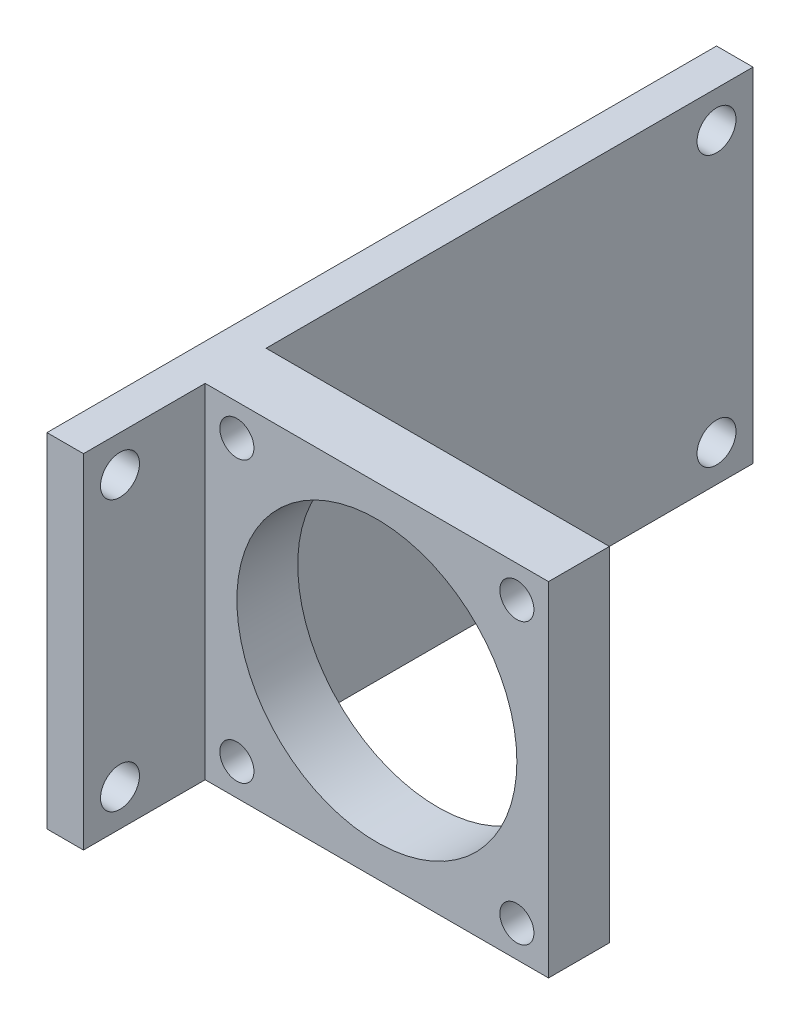
ISO-10303-21;
HEADER;
FILE_DESCRIPTION(('STEP AP214'),'2;1');
FILE_NAME('part.step','',(''),(''),'','','');
FILE_SCHEMA(('AUTOMOTIVE_DESIGN { 1 0 10303 214 1 1 1 1 }'));
ENDSEC;
DATA;
#1=APPLICATION_CONTEXT('core data for automotive mechanical design processes');
#2=APPLICATION_PROTOCOL_DEFINITION('international standard','automotive_design',2000,#1);
#3=PRODUCT_CONTEXT('',#1,'mechanical');
#4=PRODUCT('Part','Part','',(#3));
#5=PRODUCT_RELATED_PRODUCT_CATEGORY('part','',(#4));
#6=PRODUCT_DEFINITION_FORMATION('','',#4);
#7=PRODUCT_DEFINITION_CONTEXT('part definition',#1,'design');
#8=PRODUCT_DEFINITION('design','',#6,#7);
#9=PRODUCT_DEFINITION_SHAPE('','',#8);
#10=(LENGTH_UNIT() NAMED_UNIT(*) SI_UNIT(.MILLI.,.METRE.));
#11=(NAMED_UNIT(*) PLANE_ANGLE_UNIT() SI_UNIT($,.RADIAN.));
#12=(NAMED_UNIT(*) SI_UNIT($,.STERADIAN.) SOLID_ANGLE_UNIT());
#13=UNCERTAINTY_MEASURE_WITH_UNIT(LENGTH_MEASURE(1.E-05),#10,'distance_accuracy_value','');
#14=(GEOMETRIC_REPRESENTATION_CONTEXT(3) GLOBAL_UNCERTAINTY_ASSIGNED_CONTEXT((#13)) GLOBAL_UNIT_ASSIGNED_CONTEXT((#10,
#11,#12)) REPRESENTATION_CONTEXT('',''));
#15=CARTESIAN_POINT('',(0.,0.,0.));
#16=DIRECTION('',(0.,0.,1.));
#17=DIRECTION('',(1.,0.,0.));
#18=AXIS2_PLACEMENT_3D('',#15,#16,#17);
#19=CARTESIAN_POINT('',(3.21740128406613,30.4167953770059,5.));
#20=DIRECTION('',(0.,1.,0.));
#21=DIRECTION('',(0.,0.,1.));
#22=AXIS2_PLACEMENT_3D('',#19,#20,#21);
#23=PLANE('',#22);
#24=DIRECTION('',(1.,0.,0.));
#25=VECTOR('',#24,1.);
#26=CARTESIAN_POINT('',(3.21740128406613,30.4167953770059,0.));
#27=LINE('',#26,#25);
#28=CARTESIAN_POINT('',(3.21740128406613,30.4167953770059,0.));
#29=VERTEX_POINT('',#28);
#30=CARTESIAN_POINT('',(31.4174012840661,30.4167953770059,0.));
#31=VERTEX_POINT('',#30);
#32=EDGE_CURVE('E66',#29,#31,#27,.T.);
#33=ORIENTED_EDGE('',*,*,#32,.T.);
#34=DIRECTION('',(0.,0.,-1.));
#35=VECTOR('',#34,1.);
#36=CARTESIAN_POINT('',(31.4174012840661,30.4167953770059,5.));
#37=LINE('',#36,#35);
#38=CARTESIAN_POINT('',(31.4174012840661,30.4167953770059,5.));
#39=VERTEX_POINT('',#38);
#40=EDGE_CURVE('E11',#39,#31,#37,.T.);
#41=ORIENTED_EDGE('',*,*,#40,.F.);
#42=DIRECTION('',(1.,0.,0.));
#43=VECTOR('',#42,1.);
#44=CARTESIAN_POINT('',(3.21740128406613,30.4167953770059,5.));
#45=LINE('',#44,#43);
#46=CARTESIAN_POINT('',(3.21740128406613,30.4167953770059,5.));
#47=VERTEX_POINT('',#46);
#48=EDGE_CURVE('E100',#47,#39,#45,.T.);
#49=ORIENTED_EDGE('',*,*,#48,.F.);
#50=DIRECTION('',(0.,0.,1.));
#51=VECTOR('',#50,1.);
#52=CARTESIAN_POINT('',(3.21740128406613,30.4167953770059,15.));
#53=LINE('',#52,#51);
#54=CARTESIAN_POINT('',(3.21740128406613,30.4167953770059,15.));
#55=VERTEX_POINT('',#54);
#56=EDGE_CURVE('E85',#47,#55,#53,.T.);
#57=ORIENTED_EDGE('',*,*,#56,.T.);
#58=DIRECTION('',(1.,0.,0.));
#59=VECTOR('',#58,1.);
#60=CARTESIAN_POINT('',(0.217401284066132,30.4167953770059,15.));
#61=LINE('',#60,#59);
#62=CARTESIAN_POINT('',(0.217401284066132,30.4167953770059,15.));
#63=VERTEX_POINT('',#62);
#64=EDGE_CURVE('E149',#63,#55,#61,.T.);
#65=ORIENTED_EDGE('',*,*,#64,.F.);
#66=DIRECTION('',(0.,0.,1.));
#67=VECTOR('',#66,1.);
#68=CARTESIAN_POINT('',(0.217401284066132,30.4167953770059,15.));
#69=LINE('',#68,#67);
#70=CARTESIAN_POINT('',(0.217401284066132,30.4167953770058,-40.));
#71=VERTEX_POINT('',#70);
#72=EDGE_CURVE('E146',#71,#63,#69,.T.);
#73=ORIENTED_EDGE('',*,*,#72,.F.);
#74=DIRECTION('',(1.,0.,0.));
#75=VECTOR('',#74,1.);
#76=CARTESIAN_POINT('',(0.217401284066132,30.4167953770058,-40.));
#77=LINE('',#76,#75);
#78=CARTESIAN_POINT('',(3.21740128406613,30.4167953770058,-40.));
#79=VERTEX_POINT('',#78);
#80=EDGE_CURVE('E156',#71,#79,#77,.T.);
#81=ORIENTED_EDGE('',*,*,#80,.T.);
#82=EDGE_CURVE('E97',#79,#29,#53,.T.);
#83=ORIENTED_EDGE('',*,*,#82,.T.);
#84=EDGE_LOOP('',(#33,#41,#49,#57,#65,#73,#81,#83));
#85=FACE_BOUND('',#84,.T.);
#86=ADVANCED_FACE('F36',(#85),#23,.F.);
#87=CARTESIAN_POINT('',(31.4174012840661,58.6167953770059,5.));
#88=DIRECTION('',(-1.,0.,0.));
#89=DIRECTION('',(0.,-1.,0.));
#90=AXIS2_PLACEMENT_3D('',#87,#88,#89);
#91=PLANE('',#90);
#92=DIRECTION('',(0.,1.,0.));
#93=VECTOR('',#92,1.);
#94=CARTESIAN_POINT('',(31.4174012840661,58.6167953770059,0.));
#95=LINE('',#94,#93);
#96=CARTESIAN_POINT('',(31.4174012840661,58.6167953770059,0.));
#97=VERTEX_POINT('',#96);
#98=EDGE_CURVE('E107',#31,#97,#95,.T.);
#99=ORIENTED_EDGE('',*,*,#98,.T.);
#100=DIRECTION('',(0.,0.,-1.));
#101=VECTOR('',#100,1.);
#102=CARTESIAN_POINT('',(31.4174012840661,58.6167953770059,5.));
#103=LINE('',#102,#101);
#104=CARTESIAN_POINT('',(31.4174012840661,58.6167953770059,5.));
#105=VERTEX_POINT('',#104);
#106=EDGE_CURVE('E45',#105,#97,#103,.T.);
#107=ORIENTED_EDGE('',*,*,#106,.F.);
#108=DIRECTION('',(0.,1.,0.));
#109=VECTOR('',#108,1.);
#110=CARTESIAN_POINT('',(31.4174012840661,58.6167953770059,5.));
#111=LINE('',#110,#109);
#112=EDGE_CURVE('E54',#39,#105,#111,.T.);
#113=ORIENTED_EDGE('',*,*,#112,.F.);
#114=ORIENTED_EDGE('',*,*,#40,.T.);
#115=EDGE_LOOP('',(#99,#107,#113,#114));
#116=FACE_BOUND('',#115,.T.);
#117=ADVANCED_FACE('F207',(#116),#91,.F.);
#118=CARTESIAN_POINT('',(3.21740128406613,58.6167953770059,5.));
#119=DIRECTION('',(0.,-1.,0.));
#120=DIRECTION('',(0.,0.,-1.));
#121=AXIS2_PLACEMENT_3D('',#118,#119,#120);
#122=PLANE('',#121);
#123=DIRECTION('',(-1.,0.,0.));
#124=VECTOR('',#123,1.);
#125=CARTESIAN_POINT('',(3.21740128406613,58.6167953770059,0.));
#126=LINE('',#125,#124);
#127=CARTESIAN_POINT('',(3.21740128406613,58.6167953770059,0.));
#128=VERTEX_POINT('',#127);
#129=EDGE_CURVE('E105',#97,#128,#126,.T.);
#130=ORIENTED_EDGE('',*,*,#129,.T.);
#131=DIRECTION('',(0.,0.,-1.));
#132=VECTOR('',#131,1.);
#133=CARTESIAN_POINT('',(3.21740128406613,58.6167953770059,15.));
#134=LINE('',#133,#132);
#135=CARTESIAN_POINT('',(3.21740128406613,58.6167953770059,-40.));
#136=VERTEX_POINT('',#135);
#137=EDGE_CURVE('E75',#128,#136,#134,.T.);
#138=ORIENTED_EDGE('',*,*,#137,.T.);
#139=DIRECTION('',(1.,0.,0.));
#140=VECTOR('',#139,1.);
#141=CARTESIAN_POINT('',(0.217401284066127,58.6167953770059,-40.));
#142=LINE('',#141,#140);
#143=CARTESIAN_POINT('',(0.217401284066127,58.6167953770059,-40.));
#144=VERTEX_POINT('',#143);
#145=EDGE_CURVE('E159',#144,#136,#142,.T.);
#146=ORIENTED_EDGE('',*,*,#145,.F.);
#147=DIRECTION('',(0.,0.,-1.));
#148=VECTOR('',#147,1.);
#149=CARTESIAN_POINT('',(0.217401284066127,58.6167953770059,15.));
#150=LINE('',#149,#148);
#151=CARTESIAN_POINT('',(0.217401284066127,58.6167953770059,15.));
#152=VERTEX_POINT('',#151);
#153=EDGE_CURVE('E140',#152,#144,#150,.T.);
#154=ORIENTED_EDGE('',*,*,#153,.F.);
#155=DIRECTION('',(1.,0.,0.));
#156=VECTOR('',#155,1.);
#157=CARTESIAN_POINT('',(0.217401284066127,58.6167953770059,15.));
#158=LINE('',#157,#156);
#159=CARTESIAN_POINT('',(3.21740128406613,58.6167953770059,15.));
#160=VERTEX_POINT('',#159);
#161=EDGE_CURVE('E162',#152,#160,#158,.T.);
#162=ORIENTED_EDGE('',*,*,#161,.T.);
#163=CARTESIAN_POINT('',(3.21740128406613,58.6167953770059,5.));
#164=VERTEX_POINT('',#163);
#165=EDGE_CURVE('E151',#160,#164,#134,.T.);
#166=ORIENTED_EDGE('',*,*,#165,.T.);
#167=DIRECTION('',(-1.,0.,0.));
#168=VECTOR('',#167,1.);
#169=CARTESIAN_POINT('',(3.21740128406613,58.6167953770059,5.));
#170=LINE('',#169,#168);
#171=EDGE_CURVE('E104',#105,#164,#170,.T.);
#172=ORIENTED_EDGE('',*,*,#171,.F.);
#173=ORIENTED_EDGE('',*,*,#106,.T.);
#174=EDGE_LOOP('',(#130,#138,#146,#154,#162,#166,#172,#173));
#175=FACE_BOUND('',#174,.T.);
#176=ADVANCED_FACE('F198',(#175),#122,.F.);
#177=CARTESIAN_POINT('',(0.,0.,5.));
#178=DIRECTION('',(0.,0.,1.));
#179=DIRECTION('',(1.,0.,0.));
#180=AXIS2_PLACEMENT_3D('',#177,#178,#179);
#181=PLANE('',#180);
#182=CARTESIAN_POINT('',(17.3174012840661,44.5167953770059,5.));
#183=DIRECTION('',(0.,0.,1.));
#184=DIRECTION('',(1.,0.,0.));
#185=AXIS2_PLACEMENT_3D('',#182,#183,#184);
#186=CIRCLE('',#185,11.5);
#187=CARTESIAN_POINT('',(28.8174012840661,44.5167953770059,5.));
#188=VERTEX_POINT('',#187);
#189=EDGE_CURVE('E165',#188,#188,#186,.T.);
#190=ORIENTED_EDGE('',*,*,#189,.F.);
#191=EDGE_LOOP('',(#190));
#192=FACE_BOUND('',#191,.T.);
#193=CARTESIAN_POINT('',(5.81740128406613,33.0167953770059,5.));
#194=DIRECTION('',(0.,0.,1.));
#195=DIRECTION('',(1.,0.,0.));
#196=AXIS2_PLACEMENT_3D('',#193,#194,#195);
#197=CIRCLE('',#196,1.4);
#198=CARTESIAN_POINT('',(7.21740128406613,33.0167953770059,5.));
#199=VERTEX_POINT('',#198);
#200=EDGE_CURVE('E169',#199,#199,#197,.T.);
#201=ORIENTED_EDGE('',*,*,#200,.F.);
#202=EDGE_LOOP('',(#201));
#203=FACE_BOUND('',#202,.T.);
#204=CARTESIAN_POINT('',(28.8174012840661,33.0167953770059,5.));
#205=DIRECTION('',(0.,0.,1.));
#206=DIRECTION('',(1.,0.,0.));
#207=AXIS2_PLACEMENT_3D('',#204,#205,#206);
#208=CIRCLE('',#207,1.4);
#209=CARTESIAN_POINT('',(30.2174012840661,33.0167953770059,5.));
#210=VERTEX_POINT('',#209);
#211=EDGE_CURVE('E181',#210,#210,#208,.T.);
#212=ORIENTED_EDGE('',*,*,#211,.F.);
#213=EDGE_LOOP('',(#212));
#214=FACE_BOUND('',#213,.T.);
#215=CARTESIAN_POINT('',(28.8174012840661,56.0167953770059,5.));
#216=DIRECTION('',(0.,0.,1.));
#217=DIRECTION('',(1.,0.,0.));
#218=AXIS2_PLACEMENT_3D('',#215,#216,#217);
#219=CIRCLE('',#218,1.4);
#220=CARTESIAN_POINT('',(30.2174012840661,56.0167953770059,5.));
#221=VERTEX_POINT('',#220);
#222=EDGE_CURVE('E175',#221,#221,#219,.T.);
#223=ORIENTED_EDGE('',*,*,#222,.F.);
#224=EDGE_LOOP('',(#223));
#225=FACE_BOUND('',#224,.T.);
#226=CARTESIAN_POINT('',(5.81740128406613,56.0167953770059,5.));
#227=DIRECTION('',(0.,0.,1.));
#228=DIRECTION('',(1.,0.,0.));
#229=AXIS2_PLACEMENT_3D('',#226,#227,#228);
#230=CIRCLE('',#229,1.4);
#231=CARTESIAN_POINT('',(7.21740128406613,56.0167953770059,5.));
#232=VERTEX_POINT('',#231);
#233=EDGE_CURVE('E110',#232,#232,#230,.T.);
#234=ORIENTED_EDGE('',*,*,#233,.F.);
#235=EDGE_LOOP('',(#234));
#236=FACE_BOUND('',#235,.T.);
#237=DIRECTION('',(0.,-1.,0.));
#238=VECTOR('',#237,1.);
#239=CARTESIAN_POINT('',(3.21740128406613,58.6167953770059,5.));
#240=LINE('',#239,#238);
#241=EDGE_CURVE('E90',#164,#47,#240,.T.);
#242=ORIENTED_EDGE('',*,*,#241,.T.);
#243=ORIENTED_EDGE('',*,*,#48,.T.);
#244=ORIENTED_EDGE('',*,*,#112,.T.);
#245=ORIENTED_EDGE('',*,*,#171,.T.);
#246=EDGE_LOOP('',(#242,#243,#244,#245));
#247=FACE_BOUND('',#246,.T.);
#248=ADVANCED_FACE('F102',(#192,#203,#214,#225,#236,#247),#181,.T.);
#249=CARTESIAN_POINT('',(0.,0.,0.));
#250=DIRECTION('',(0.,0.,1.));
#251=DIRECTION('',(1.,0.,0.));
#252=AXIS2_PLACEMENT_3D('',#249,#250,#251);
#253=PLANE('',#252);
#254=CARTESIAN_POINT('',(17.3174012840661,44.5167953770059,0.));
#255=DIRECTION('',(0.,0.,1.));
#256=DIRECTION('',(1.,0.,0.));
#257=AXIS2_PLACEMENT_3D('',#254,#255,#256);
#258=CIRCLE('',#257,11.5);
#259=CARTESIAN_POINT('',(28.8174012840661,44.5167953770059,0.));
#260=VERTEX_POINT('',#259);
#261=EDGE_CURVE('E166',#260,#260,#258,.T.);
#262=ORIENTED_EDGE('',*,*,#261,.T.);
#263=EDGE_LOOP('',(#262));
#264=FACE_BOUND('',#263,.T.);
#265=CARTESIAN_POINT('',(5.81740128406613,33.0167953770059,0.));
#266=DIRECTION('',(0.,0.,1.));
#267=DIRECTION('',(1.,0.,0.));
#268=AXIS2_PLACEMENT_3D('',#265,#266,#267);
#269=CIRCLE('',#268,1.4);
#270=CARTESIAN_POINT('',(7.21740128406613,33.0167953770059,0.));
#271=VERTEX_POINT('',#270);
#272=EDGE_CURVE('E184',#271,#271,#269,.T.);
#273=ORIENTED_EDGE('',*,*,#272,.T.);
#274=EDGE_LOOP('',(#273));
#275=FACE_BOUND('',#274,.T.);
#276=CARTESIAN_POINT('',(28.8174012840661,33.0167953770059,0.));
#277=DIRECTION('',(0.,0.,1.));
#278=DIRECTION('',(1.,0.,0.));
#279=AXIS2_PLACEMENT_3D('',#276,#277,#278);
#280=CIRCLE('',#279,1.4);
#281=CARTESIAN_POINT('',(30.2174012840661,33.0167953770059,0.));
#282=VERTEX_POINT('',#281);
#283=EDGE_CURVE('E178',#282,#282,#280,.T.);
#284=ORIENTED_EDGE('',*,*,#283,.T.);
#285=EDGE_LOOP('',(#284));
#286=FACE_BOUND('',#285,.T.);
#287=CARTESIAN_POINT('',(28.8174012840661,56.0167953770059,0.));
#288=DIRECTION('',(0.,0.,1.));
#289=DIRECTION('',(1.,0.,0.));
#290=AXIS2_PLACEMENT_3D('',#287,#288,#289);
#291=CIRCLE('',#290,1.4);
#292=CARTESIAN_POINT('',(30.2174012840661,56.0167953770059,0.));
#293=VERTEX_POINT('',#292);
#294=EDGE_CURVE('E172',#293,#293,#291,.T.);
#295=ORIENTED_EDGE('',*,*,#294,.T.);
#296=EDGE_LOOP('',(#295));
#297=FACE_BOUND('',#296,.T.);
#298=CARTESIAN_POINT('',(5.81740128406613,56.0167953770059,0.));
#299=DIRECTION('',(0.,0.,1.));
#300=DIRECTION('',(1.,0.,0.));
#301=AXIS2_PLACEMENT_3D('',#298,#299,#300);
#302=CIRCLE('',#301,1.4);
#303=CARTESIAN_POINT('',(7.21740128406613,56.0167953770059,0.));
#304=VERTEX_POINT('',#303);
#305=EDGE_CURVE('E117',#304,#304,#302,.T.);
#306=ORIENTED_EDGE('',*,*,#305,.T.);
#307=EDGE_LOOP('',(#306));
#308=FACE_BOUND('',#307,.T.);
#309=DIRECTION('',(0.,-1.,0.));
#310=VECTOR('',#309,1.);
#311=CARTESIAN_POINT('',(3.21740128406613,58.6167953770059,0.));
#312=LINE('',#311,#310);
#313=EDGE_CURVE('E115',#128,#29,#312,.T.);
#314=ORIENTED_EDGE('',*,*,#313,.F.);
#315=ORIENTED_EDGE('',*,*,#129,.F.);
#316=ORIENTED_EDGE('',*,*,#98,.F.);
#317=ORIENTED_EDGE('',*,*,#32,.F.);
#318=EDGE_LOOP('',(#314,#315,#316,#317));
#319=FACE_BOUND('',#318,.T.);
#320=ADVANCED_FACE('F197',(#264,#275,#286,#297,#308,#319),#253,.F.);
#321=CARTESIAN_POINT('',(5.81740128406613,56.0167953770059,0.));
#322=DIRECTION('',(0.,0.,1.));
#323=DIRECTION('',(1.,0.,0.));
#324=AXIS2_PLACEMENT_3D('',#321,#322,#323);
#325=CYLINDRICAL_SURFACE('',#324,1.4);
#326=ORIENTED_EDGE('',*,*,#305,.F.);
#327=EDGE_LOOP('',(#326));
#328=FACE_BOUND('',#327,.T.);
#329=ORIENTED_EDGE('',*,*,#233,.T.);
#330=EDGE_LOOP('',(#329));
#331=FACE_BOUND('',#330,.T.);
#332=ADVANCED_FACE('F194',(#328,#331),#325,.F.);
#333=CARTESIAN_POINT('',(28.8174012840661,56.0167953770059,0.));
#334=DIRECTION('',(0.,0.,1.));
#335=DIRECTION('',(1.,0.,0.));
#336=AXIS2_PLACEMENT_3D('',#333,#334,#335);
#337=CYLINDRICAL_SURFACE('',#336,1.4);
#338=ORIENTED_EDGE('',*,*,#294,.F.);
#339=EDGE_LOOP('',(#338));
#340=FACE_BOUND('',#339,.T.);
#341=ORIENTED_EDGE('',*,*,#222,.T.);
#342=EDGE_LOOP('',(#341));
#343=FACE_BOUND('',#342,.T.);
#344=ADVANCED_FACE('F269',(#340,#343),#337,.F.);
#345=CARTESIAN_POINT('',(28.8174012840661,33.0167953770059,0.));
#346=DIRECTION('',(0.,0.,1.));
#347=DIRECTION('',(1.,0.,0.));
#348=AXIS2_PLACEMENT_3D('',#345,#346,#347);
#349=CYLINDRICAL_SURFACE('',#348,1.4);
#350=ORIENTED_EDGE('',*,*,#283,.F.);
#351=EDGE_LOOP('',(#350));
#352=FACE_BOUND('',#351,.T.);
#353=ORIENTED_EDGE('',*,*,#211,.T.);
#354=EDGE_LOOP('',(#353));
#355=FACE_BOUND('',#354,.T.);
#356=ADVANCED_FACE('F272',(#352,#355),#349,.F.);
#357=CARTESIAN_POINT('',(5.81740128406613,33.0167953770059,0.));
#358=DIRECTION('',(0.,0.,1.));
#359=DIRECTION('',(1.,0.,0.));
#360=AXIS2_PLACEMENT_3D('',#357,#358,#359);
#361=CYLINDRICAL_SURFACE('',#360,1.4);
#362=ORIENTED_EDGE('',*,*,#272,.F.);
#363=EDGE_LOOP('',(#362));
#364=FACE_BOUND('',#363,.T.);
#365=ORIENTED_EDGE('',*,*,#200,.T.);
#366=EDGE_LOOP('',(#365));
#367=FACE_BOUND('',#366,.T.);
#368=ADVANCED_FACE('F267',(#364,#367),#361,.F.);
#369=CARTESIAN_POINT('',(17.3174012840661,44.5167953770059,0.));
#370=DIRECTION('',(0.,0.,1.));
#371=DIRECTION('',(1.,0.,0.));
#372=AXIS2_PLACEMENT_3D('',#369,#370,#371);
#373=CYLINDRICAL_SURFACE('',#372,11.5);
#374=ORIENTED_EDGE('',*,*,#261,.F.);
#375=EDGE_LOOP('',(#374));
#376=FACE_BOUND('',#375,.T.);
#377=ORIENTED_EDGE('',*,*,#189,.T.);
#378=EDGE_LOOP('',(#377));
#379=FACE_BOUND('',#378,.T.);
#380=ADVANCED_FACE('F261',(#376,#379),#373,.F.);
#381=CARTESIAN_POINT('',(3.21740128406614,0.,0.));
#382=DIRECTION('',(1.,0.,0.));
#383=DIRECTION('',(0.,1.,0.));
#384=AXIS2_PLACEMENT_3D('',#381,#382,#383);
#385=PLANE('',#384);
#386=CARTESIAN_POINT('',(3.21740128406613,55.6167953770059,12.));
#387=DIRECTION('',(1.,0.,0.));
#388=DIRECTION('',(0.,1.,0.));
#389=AXIS2_PLACEMENT_3D('',#386,#387,#388);
#390=CIRCLE('',#389,1.6);
#391=CARTESIAN_POINT('',(3.21740128406613,57.2167953770059,12.));
#392=VERTEX_POINT('',#391);
#393=EDGE_CURVE('E373',#392,#392,#390,.T.);
#394=ORIENTED_EDGE('',*,*,#393,.F.);
#395=EDGE_LOOP('',(#394));
#396=FACE_BOUND('',#395,.T.);
#397=CARTESIAN_POINT('',(3.21740128406613,33.4167953770059,12.));
#398=DIRECTION('',(1.,0.,0.));
#399=DIRECTION('',(0.,1.,0.));
#400=AXIS2_PLACEMENT_3D('',#397,#398,#399);
#401=CIRCLE('',#400,1.6);
#402=CARTESIAN_POINT('',(3.21740128406613,35.0167953770059,12.));
#403=VERTEX_POINT('',#402);
#404=EDGE_CURVE('E380',#403,#403,#401,.T.);
#405=ORIENTED_EDGE('',*,*,#404,.F.);
#406=EDGE_LOOP('',(#405));
#407=FACE_BOUND('',#406,.T.);
#408=ORIENTED_EDGE('',*,*,#241,.F.);
#409=ORIENTED_EDGE('',*,*,#165,.F.);
#410=DIRECTION('',(0.,1.,0.));
#411=VECTOR('',#410,1.);
#412=CARTESIAN_POINT('',(3.21740128406613,58.6167953770059,15.));
#413=LINE('',#412,#411);
#414=EDGE_CURVE('E94',#55,#160,#413,.T.);
#415=ORIENTED_EDGE('',*,*,#414,.F.);
#416=ORIENTED_EDGE('',*,*,#56,.F.);
#417=EDGE_LOOP('',(#408,#409,#415,#416));
#418=FACE_BOUND('',#417,.T.);
#419=ADVANCED_FACE('F87',(#396,#407,#418),#385,.T.);
#420=CARTESIAN_POINT('',(0.217401284066127,58.6167953770059,15.));
#421=DIRECTION('',(0.,0.,-1.));
#422=DIRECTION('',(0.,1.,0.));
#423=AXIS2_PLACEMENT_3D('',#420,#421,#422);
#424=PLANE('',#423);
#425=ORIENTED_EDGE('',*,*,#414,.T.);
#426=ORIENTED_EDGE('',*,*,#161,.F.);
#427=DIRECTION('',(0.,1.,0.));
#428=VECTOR('',#427,1.);
#429=CARTESIAN_POINT('',(0.217401284066127,58.6167953770059,15.));
#430=LINE('',#429,#428);
#431=EDGE_CURVE('E137',#63,#152,#430,.T.);
#432=ORIENTED_EDGE('',*,*,#431,.F.);
#433=ORIENTED_EDGE('',*,*,#64,.T.);
#434=EDGE_LOOP('',(#425,#426,#432,#433));
#435=FACE_BOUND('',#434,.T.);
#436=ADVANCED_FACE('F253',(#435),#424,.F.);
#437=CARTESIAN_POINT('',(0.217401284066127,58.6167953770059,-40.));
#438=DIRECTION('',(0.,0.,1.));
#439=DIRECTION('',(0.,-1.,0.));
#440=AXIS2_PLACEMENT_3D('',#437,#438,#439);
#441=PLANE('',#440);
#442=DIRECTION('',(0.,-1.,0.));
#443=VECTOR('',#442,1.);
#444=CARTESIAN_POINT('',(3.21740128406613,58.6167953770059,-40.));
#445=LINE('',#444,#443);
#446=EDGE_CURVE('E98',#136,#79,#445,.T.);
#447=ORIENTED_EDGE('',*,*,#446,.T.);
#448=ORIENTED_EDGE('',*,*,#80,.F.);
#449=DIRECTION('',(0.,-1.,0.));
#450=VECTOR('',#449,1.);
#451=CARTESIAN_POINT('',(0.217401284066127,58.6167953770059,-40.));
#452=LINE('',#451,#450);
#453=EDGE_CURVE('E143',#144,#71,#452,.T.);
#454=ORIENTED_EDGE('',*,*,#453,.F.);
#455=ORIENTED_EDGE('',*,*,#145,.T.);
#456=EDGE_LOOP('',(#447,#448,#454,#455));
#457=FACE_BOUND('',#456,.T.);
#458=ADVANCED_FACE('F235',(#457),#441,.F.);
#459=CARTESIAN_POINT('',(0.217401284066137,0.,0.));
#460=DIRECTION('',(1.,0.,0.));
#461=DIRECTION('',(0.,1.,0.));
#462=AXIS2_PLACEMENT_3D('',#459,#460,#461);
#463=PLANE('',#462);
#464=CARTESIAN_POINT('',(0.217401284066132,33.4167953770058,-37.));
#465=DIRECTION('',(1.,0.,0.));
#466=DIRECTION('',(0.,1.,0.));
#467=AXIS2_PLACEMENT_3D('',#464,#465,#466);
#468=CIRCLE('',#467,1.6);
#469=CARTESIAN_POINT('',(0.217401284066131,35.0167953770058,-37.));
#470=VERTEX_POINT('',#469);
#471=EDGE_CURVE('E123',#470,#470,#468,.T.);
#472=ORIENTED_EDGE('',*,*,#471,.T.);
#473=EDGE_LOOP('',(#472));
#474=FACE_BOUND('',#473,.T.);
#475=CARTESIAN_POINT('',(0.217401284066128,55.6167953770059,12.));
#476=DIRECTION('',(1.,0.,0.));
#477=DIRECTION('',(0.,1.,0.));
#478=AXIS2_PLACEMENT_3D('',#475,#476,#477);
#479=CIRCLE('',#478,1.6);
#480=CARTESIAN_POINT('',(0.217401284066127,57.2167953770059,12.));
#481=VERTEX_POINT('',#480);
#482=EDGE_CURVE('E39',#481,#481,#479,.T.);
#483=ORIENTED_EDGE('',*,*,#482,.T.);
#484=EDGE_LOOP('',(#483));
#485=FACE_BOUND('',#484,.T.);
#486=CARTESIAN_POINT('',(0.217401284066132,33.4167953770059,12.));
#487=DIRECTION('',(1.,0.,0.));
#488=DIRECTION('',(0.,1.,0.));
#489=AXIS2_PLACEMENT_3D('',#486,#487,#488);
#490=CIRCLE('',#489,1.6);
#491=CARTESIAN_POINT('',(0.217401284066131,35.0167953770059,12.));
#492=VERTEX_POINT('',#491);
#493=EDGE_CURVE('E121',#492,#492,#490,.T.);
#494=ORIENTED_EDGE('',*,*,#493,.T.);
#495=EDGE_LOOP('',(#494));
#496=FACE_BOUND('',#495,.T.);
#497=CARTESIAN_POINT('',(0.217401284066128,55.6167953770059,-37.));
#498=DIRECTION('',(1.,0.,0.));
#499=DIRECTION('',(0.,1.,0.));
#500=AXIS2_PLACEMENT_3D('',#497,#498,#499);
#501=CIRCLE('',#500,1.6);
#502=CARTESIAN_POINT('',(0.217401284066127,57.2167953770059,-37.));
#503=VERTEX_POINT('',#502);
#504=EDGE_CURVE('E128',#503,#503,#501,.T.);
#505=ORIENTED_EDGE('',*,*,#504,.T.);
#506=EDGE_LOOP('',(#505));
#507=FACE_BOUND('',#506,.T.);
#508=ORIENTED_EDGE('',*,*,#431,.T.);
#509=ORIENTED_EDGE('',*,*,#153,.T.);
#510=ORIENTED_EDGE('',*,*,#453,.T.);
#511=ORIENTED_EDGE('',*,*,#72,.T.);
#512=EDGE_LOOP('',(#508,#509,#510,#511));
#513=FACE_BOUND('',#512,.T.);
#514=ADVANCED_FACE('F251',(#474,#485,#496,#507,#513),#463,.F.);
#515=CARTESIAN_POINT('',(3.21740128406613,33.4167953770058,-37.));
#516=DIRECTION('',(1.,0.,0.));
#517=DIRECTION('',(0.,1.,0.));
#518=AXIS2_PLACEMENT_3D('',#515,#516,#517);
#519=CIRCLE('',#518,1.6);
#520=CARTESIAN_POINT('',(3.21740128406613,35.0167953770058,-37.));
#521=VERTEX_POINT('',#520);
#522=EDGE_CURVE('E379',#521,#521,#519,.T.);
#523=ORIENTED_EDGE('',*,*,#522,.F.);
#524=EDGE_LOOP('',(#523));
#525=FACE_BOUND('',#524,.T.);
#526=CARTESIAN_POINT('',(3.21740128406613,55.6167953770059,-37.));
#527=DIRECTION('',(1.,0.,0.));
#528=DIRECTION('',(0.,1.,0.));
#529=AXIS2_PLACEMENT_3D('',#526,#527,#528);
#530=CIRCLE('',#529,1.6);
#531=CARTESIAN_POINT('',(3.21740128406613,57.2167953770059,-37.));
#532=VERTEX_POINT('',#531);
#533=EDGE_CURVE('E133',#532,#532,#530,.T.);
#534=ORIENTED_EDGE('',*,*,#533,.F.);
#535=EDGE_LOOP('',(#534));
#536=FACE_BOUND('',#535,.T.);
#537=ORIENTED_EDGE('',*,*,#137,.F.);
#538=ORIENTED_EDGE('',*,*,#313,.T.);
#539=ORIENTED_EDGE('',*,*,#82,.F.);
#540=ORIENTED_EDGE('',*,*,#446,.F.);
#541=EDGE_LOOP('',(#537,#538,#539,#540));
#542=FACE_BOUND('',#541,.T.);
#543=ADVANCED_FACE('F225',(#525,#536,#542),#385,.T.);
#544=CARTESIAN_POINT('',(-1.78259871593387,55.6167953770059,-37.));
#545=DIRECTION('',(1.,0.,0.));
#546=DIRECTION('',(0.,1.,0.));
#547=AXIS2_PLACEMENT_3D('',#544,#545,#546);
#548=CYLINDRICAL_SURFACE('',#547,1.6);
#549=ORIENTED_EDGE('',*,*,#533,.T.);
#550=EDGE_LOOP('',(#549));
#551=FACE_BOUND('',#550,.T.);
#552=ORIENTED_EDGE('',*,*,#504,.F.);
#553=EDGE_LOOP('',(#552));
#554=FACE_BOUND('',#553,.T.);
#555=ADVANCED_FACE('F327',(#551,#554),#548,.F.);
#556=CARTESIAN_POINT('',(-1.78259871593387,33.4167953770058,-37.));
#557=DIRECTION('',(1.,0.,0.));
#558=DIRECTION('',(0.,1.,0.));
#559=AXIS2_PLACEMENT_3D('',#556,#557,#558);
#560=CYLINDRICAL_SURFACE('',#559,1.6);
#561=ORIENTED_EDGE('',*,*,#522,.T.);
#562=EDGE_LOOP('',(#561));
#563=FACE_BOUND('',#562,.T.);
#564=ORIENTED_EDGE('',*,*,#471,.F.);
#565=EDGE_LOOP('',(#564));
#566=FACE_BOUND('',#565,.T.);
#567=ADVANCED_FACE('F336',(#563,#566),#560,.F.);
#568=CARTESIAN_POINT('',(-1.78259871593387,33.4167953770059,12.));
#569=DIRECTION('',(1.,0.,0.));
#570=DIRECTION('',(0.,1.,0.));
#571=AXIS2_PLACEMENT_3D('',#568,#569,#570);
#572=CYLINDRICAL_SURFACE('',#571,1.6);
#573=ORIENTED_EDGE('',*,*,#404,.T.);
#574=EDGE_LOOP('',(#573));
#575=FACE_BOUND('',#574,.T.);
#576=ORIENTED_EDGE('',*,*,#493,.F.);
#577=EDGE_LOOP('',(#576));
#578=FACE_BOUND('',#577,.T.);
#579=ADVANCED_FACE('F346',(#575,#578),#572,.F.);
#580=CARTESIAN_POINT('',(-1.78259871593387,55.6167953770059,12.));
#581=DIRECTION('',(1.,0.,0.));
#582=DIRECTION('',(0.,1.,0.));
#583=AXIS2_PLACEMENT_3D('',#580,#581,#582);
#584=CYLINDRICAL_SURFACE('',#583,1.6);
#585=ORIENTED_EDGE('',*,*,#393,.T.);
#586=EDGE_LOOP('',(#585));
#587=FACE_BOUND('',#586,.T.);
#588=ORIENTED_EDGE('',*,*,#482,.F.);
#589=EDGE_LOOP('',(#588));
#590=FACE_BOUND('',#589,.T.);
#591=ADVANCED_FACE('F356',(#587,#590),#584,.F.);
#592=CLOSED_SHELL('',(#86,#117,#176,#248,#320,#332,#344,#356,#368,#380,#419,#436,#458,#514,#543,
#555,#567,#579,#591));
#593=MANIFOLD_SOLID_BREP('B2',#592);
#594=ADVANCED_BREP_SHAPE_REPRESENTATION('',(#18,#593),#14);
#595=SHAPE_DEFINITION_REPRESENTATION(#9,#594);
ENDSEC;
END-ISO-10303-21;
